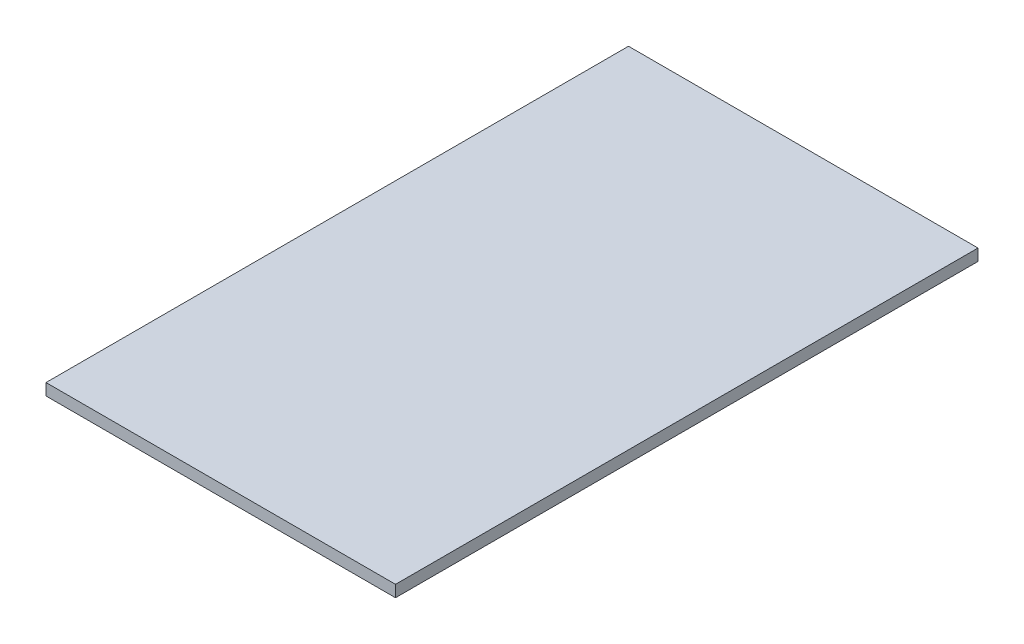
ISO-10303-21;
HEADER;
FILE_DESCRIPTION(('STEP AP214'),'2;1');
FILE_NAME('part.step','',(''),(''),'','','');
FILE_SCHEMA(('AUTOMOTIVE_DESIGN { 1 0 10303 214 1 1 1 1 }'));
ENDSEC;
DATA;
#1=APPLICATION_CONTEXT('core data for automotive mechanical design processes');
#2=APPLICATION_PROTOCOL_DEFINITION('international standard','automotive_design',2000,#1);
#3=PRODUCT_CONTEXT('',#1,'mechanical');
#4=PRODUCT('Part','Part','',(#3));
#5=PRODUCT_RELATED_PRODUCT_CATEGORY('part','',(#4));
#6=PRODUCT_DEFINITION_FORMATION('','',#4);
#7=PRODUCT_DEFINITION_CONTEXT('part definition',#1,'design');
#8=PRODUCT_DEFINITION('design','',#6,#7);
#9=PRODUCT_DEFINITION_SHAPE('','',#8);
#10=(LENGTH_UNIT() NAMED_UNIT(*) SI_UNIT(.MILLI.,.METRE.));
#11=(NAMED_UNIT(*) PLANE_ANGLE_UNIT() SI_UNIT($,.RADIAN.));
#12=(NAMED_UNIT(*) SI_UNIT($,.STERADIAN.) SOLID_ANGLE_UNIT());
#13=UNCERTAINTY_MEASURE_WITH_UNIT(LENGTH_MEASURE(1.E-05),#10,'distance_accuracy_value','');
#14=(GEOMETRIC_REPRESENTATION_CONTEXT(3) GLOBAL_UNCERTAINTY_ASSIGNED_CONTEXT((#13)) GLOBAL_UNIT_ASSIGNED_CONTEXT((#10,
#11,#12)) REPRESENTATION_CONTEXT('',''));
#15=CARTESIAN_POINT('',(0.,0.,0.));
#16=DIRECTION('',(0.,0.,1.));
#17=DIRECTION('',(1.,0.,0.));
#18=AXIS2_PLACEMENT_3D('',#15,#16,#17);
#19=CARTESIAN_POINT('',(0.15,0.,-1.));
#20=DIRECTION('',(1.,0.,0.));
#21=DIRECTION('',(0.,1.,0.));
#22=AXIS2_PLACEMENT_3D('',#19,#20,#21);
#23=PLANE('',#22);
#24=DIRECTION('',(0.,0.,-1.));
#25=VECTOR('',#24,1.);
#26=CARTESIAN_POINT('',(0.15,0.,-0.5));
#27=LINE('',#26,#25);
#28=CARTESIAN_POINT('',(0.15,0.,-0.5));
#29=VERTEX_POINT('',#28);
#30=CARTESIAN_POINT('',(0.15,0.,-1.));
#31=VERTEX_POINT('',#30);
#32=EDGE_CURVE('E104',#29,#31,#27,.T.);
#33=ORIENTED_EDGE('',*,*,#32,.F.);
#34=DIRECTION('',(0.,-1.,0.));
#35=VECTOR('',#34,1.);
#36=CARTESIAN_POINT('',(0.15,0.,-0.5));
#37=LINE('',#36,#35);
#38=CARTESIAN_POINT('',(0.15,-0.01,-0.5));
#39=VERTEX_POINT('',#38);
#40=EDGE_CURVE('E67',#29,#39,#37,.T.);
#41=ORIENTED_EDGE('',*,*,#40,.T.);
#42=DIRECTION('',(0.,0.,1.));
#43=VECTOR('',#42,1.);
#44=CARTESIAN_POINT('',(0.15,-0.01,-0.5));
#45=LINE('',#44,#43);
#46=CARTESIAN_POINT('',(0.15,-0.01,-1.));
#47=VERTEX_POINT('',#46);
#48=EDGE_CURVE('E83',#47,#39,#45,.T.);
#49=ORIENTED_EDGE('',*,*,#48,.F.);
#50=DIRECTION('',(0.,-1.,0.));
#51=VECTOR('',#50,1.);
#52=CARTESIAN_POINT('',(0.15,0.,-1.));
#53=LINE('',#52,#51);
#54=EDGE_CURVE('E11',#31,#47,#53,.T.);
#55=ORIENTED_EDGE('',*,*,#54,.F.);
#56=EDGE_LOOP('',(#33,#41,#49,#55));
#57=FACE_BOUND('',#56,.T.);
#58=ADVANCED_FACE('F17',(#57),#23,.T.);
#59=CARTESIAN_POINT('',(-0.15,0.,-1.));
#60=DIRECTION('',(0.,0.,-1.));
#61=DIRECTION('',(0.,-1.,0.));
#62=AXIS2_PLACEMENT_3D('',#59,#60,#61);
#63=PLANE('',#62);
#64=DIRECTION('',(-1.,0.,0.));
#65=VECTOR('',#64,1.);
#66=CARTESIAN_POINT('',(0.15,0.,-1.));
#67=LINE('',#66,#65);
#68=CARTESIAN_POINT('',(-0.15,0.,-1.));
#69=VERTEX_POINT('',#68);
#70=EDGE_CURVE('E21',#31,#69,#67,.T.);
#71=ORIENTED_EDGE('',*,*,#70,.F.);
#72=ORIENTED_EDGE('',*,*,#54,.T.);
#73=DIRECTION('',(1.,0.,0.));
#74=VECTOR('',#73,1.);
#75=CARTESIAN_POINT('',(0.15,-0.01,-1.));
#76=LINE('',#75,#74);
#77=CARTESIAN_POINT('',(-0.15,-0.01,-1.));
#78=VERTEX_POINT('',#77);
#79=EDGE_CURVE('E91',#78,#47,#76,.T.);
#80=ORIENTED_EDGE('',*,*,#79,.F.);
#81=DIRECTION('',(0.,-1.,0.));
#82=VECTOR('',#81,1.);
#83=CARTESIAN_POINT('',(-0.15,0.,-1.));
#84=LINE('',#83,#82);
#85=EDGE_CURVE('E28',#69,#78,#84,.T.);
#86=ORIENTED_EDGE('',*,*,#85,.F.);
#87=EDGE_LOOP('',(#71,#72,#80,#86));
#88=FACE_BOUND('',#87,.T.);
#89=ADVANCED_FACE('F19',(#88),#63,.T.);
#90=CARTESIAN_POINT('',(-0.15,0.,-0.5));
#91=DIRECTION('',(-1.,0.,0.));
#92=DIRECTION('',(0.,0.,1.));
#93=AXIS2_PLACEMENT_3D('',#90,#91,#92);
#94=PLANE('',#93);
#95=DIRECTION('',(0.,0.,1.));
#96=VECTOR('',#95,1.);
#97=CARTESIAN_POINT('',(-0.15,0.,-1.));
#98=LINE('',#97,#96);
#99=CARTESIAN_POINT('',(-0.15,0.,-0.5));
#100=VERTEX_POINT('',#99);
#101=EDGE_CURVE('E96',#69,#100,#98,.T.);
#102=ORIENTED_EDGE('',*,*,#101,.F.);
#103=ORIENTED_EDGE('',*,*,#85,.T.);
#104=DIRECTION('',(0.,0.,-1.));
#105=VECTOR('',#104,1.);
#106=CARTESIAN_POINT('',(-0.15,-0.01,-1.));
#107=LINE('',#106,#105);
#108=CARTESIAN_POINT('',(-0.15,-0.01,-0.5));
#109=VERTEX_POINT('',#108);
#110=EDGE_CURVE('E86',#109,#78,#107,.T.);
#111=ORIENTED_EDGE('',*,*,#110,.F.);
#112=DIRECTION('',(0.,-1.,0.));
#113=VECTOR('',#112,1.);
#114=CARTESIAN_POINT('',(-0.15,0.,-0.5));
#115=LINE('',#114,#113);
#116=EDGE_CURVE('E72',#100,#109,#115,.T.);
#117=ORIENTED_EDGE('',*,*,#116,.F.);
#118=EDGE_LOOP('',(#102,#103,#111,#117));
#119=FACE_BOUND('',#118,.T.);
#120=ADVANCED_FACE('F87',(#119),#94,.T.);
#121=CARTESIAN_POINT('',(0.15,0.,-0.5));
#122=DIRECTION('',(0.,0.,1.));
#123=DIRECTION('',(1.,0.,0.));
#124=AXIS2_PLACEMENT_3D('',#121,#122,#123);
#125=PLANE('',#124);
#126=DIRECTION('',(1.,0.,0.));
#127=VECTOR('',#126,1.);
#128=CARTESIAN_POINT('',(-0.15,0.,-0.5));
#129=LINE('',#128,#127);
#130=EDGE_CURVE('E78',#100,#29,#129,.T.);
#131=ORIENTED_EDGE('',*,*,#130,.F.);
#132=ORIENTED_EDGE('',*,*,#116,.T.);
#133=DIRECTION('',(-1.,0.,0.));
#134=VECTOR('',#133,1.);
#135=CARTESIAN_POINT('',(-0.15,-0.01,-0.5));
#136=LINE('',#135,#134);
#137=EDGE_CURVE('E76',#39,#109,#136,.T.);
#138=ORIENTED_EDGE('',*,*,#137,.F.);
#139=ORIENTED_EDGE('',*,*,#40,.F.);
#140=EDGE_LOOP('',(#131,#132,#138,#139));
#141=FACE_BOUND('',#140,.T.);
#142=ADVANCED_FACE('F74',(#141),#125,.T.);
#143=CARTESIAN_POINT('',(0.,-0.01,-0.75));
#144=DIRECTION('',(0.,-1.,0.));
#145=DIRECTION('',(0.,0.,-1.));
#146=AXIS2_PLACEMENT_3D('',#143,#144,#145);
#147=PLANE('',#146);
#148=ORIENTED_EDGE('',*,*,#137,.T.);
#149=ORIENTED_EDGE('',*,*,#110,.T.);
#150=ORIENTED_EDGE('',*,*,#79,.T.);
#151=ORIENTED_EDGE('',*,*,#48,.T.);
#152=EDGE_LOOP('',(#148,#149,#150,#151));
#153=FACE_BOUND('',#152,.T.);
#154=ADVANCED_FACE('F94',(#153),#147,.T.);
#155=CARTESIAN_POINT('',(0.,0.,-0.75));
#156=DIRECTION('',(0.,-1.,0.));
#157=DIRECTION('',(0.,0.,-1.));
#158=AXIS2_PLACEMENT_3D('',#155,#156,#157);
#159=PLANE('',#158);
#160=ORIENTED_EDGE('',*,*,#130,.T.);
#161=ORIENTED_EDGE('',*,*,#32,.T.);
#162=ORIENTED_EDGE('',*,*,#70,.T.);
#163=ORIENTED_EDGE('',*,*,#101,.T.);
#164=EDGE_LOOP('',(#160,#161,#162,#163));
#165=FACE_BOUND('',#164,.T.);
#166=ADVANCED_FACE('F125',(#165),#159,.F.);
#167=CLOSED_SHELL('',(#58,#89,#120,#142,#154,#166));
#168=MANIFOLD_SOLID_BREP('B1',#167);
#169=ADVANCED_BREP_SHAPE_REPRESENTATION('',(#18,#168),#14);
#170=SHAPE_DEFINITION_REPRESENTATION(#9,#169);
ENDSEC;
END-ISO-10303-21;
